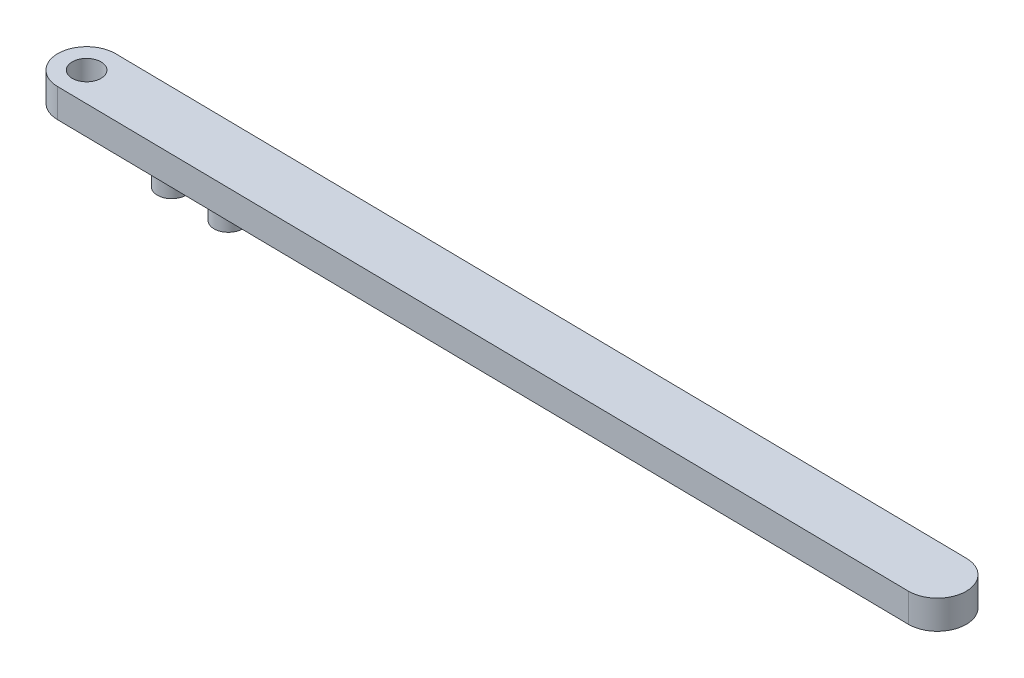
ISO-10303-21;
HEADER;
FILE_DESCRIPTION(('STEP AP214'),'2;1');
FILE_NAME('part.step','',(''),(''),'','','');
FILE_SCHEMA(('AUTOMOTIVE_DESIGN { 1 0 10303 214 1 1 1 1 }'));
ENDSEC;
DATA;
#1=APPLICATION_CONTEXT('core data for automotive mechanical design processes');
#2=APPLICATION_PROTOCOL_DEFINITION('international standard','automotive_design',2000,#1);
#3=PRODUCT_CONTEXT('',#1,'mechanical');
#4=PRODUCT('Part','Part','',(#3));
#5=PRODUCT_RELATED_PRODUCT_CATEGORY('part','',(#4));
#6=PRODUCT_DEFINITION_FORMATION('','',#4);
#7=PRODUCT_DEFINITION_CONTEXT('part definition',#1,'design');
#8=PRODUCT_DEFINITION('design','',#6,#7);
#9=PRODUCT_DEFINITION_SHAPE('','',#8);
#10=(LENGTH_UNIT() NAMED_UNIT(*) SI_UNIT(.MILLI.,.METRE.));
#11=(NAMED_UNIT(*) PLANE_ANGLE_UNIT() SI_UNIT($,.RADIAN.));
#12=(NAMED_UNIT(*) SI_UNIT($,.STERADIAN.) SOLID_ANGLE_UNIT());
#13=UNCERTAINTY_MEASURE_WITH_UNIT(LENGTH_MEASURE(1.E-05),#10,'distance_accuracy_value','');
#14=(GEOMETRIC_REPRESENTATION_CONTEXT(3) GLOBAL_UNCERTAINTY_ASSIGNED_CONTEXT((#13)) GLOBAL_UNIT_ASSIGNED_CONTEXT((#10,
#11,#12)) REPRESENTATION_CONTEXT('',''));
#15=CARTESIAN_POINT('',(0.,0.,0.));
#16=DIRECTION('',(0.,0.,1.));
#17=DIRECTION('',(1.,0.,0.));
#18=AXIS2_PLACEMENT_3D('',#15,#16,#17);
#19=CARTESIAN_POINT('',(-14.5716160355899,5.,-1.70714880270089));
#20=DIRECTION('',(0.,1.,0.));
#21=DIRECTION('',(0.,0.,1.));
#22=AXIS2_PLACEMENT_3D('',#19,#20,#21);
#23=PLANE('',#22);
#24=CARTESIAN_POINT('',(-14.5716160355899,5.,-1.70714880270089));
#25=DIRECTION('',(0.,1.,0.));
#26=DIRECTION('',(0.,0.,1.));
#27=AXIS2_PLACEMENT_3D('',#24,#25,#26);
#28=CIRCLE('',#27,5.);
#29=CARTESIAN_POINT('',(-14.5044435953561,5.,-6.70669756866698));
#30=VERTEX_POINT('',#29);
#31=CARTESIAN_POINT('',(-14.6387884758236,5.,3.2923999632652));
#32=VERTEX_POINT('',#31);
#33=EDGE_CURVE('E87',#30,#32,#28,.T.);
#34=ORIENTED_EDGE('',*,*,#33,.T.);
#35=DIRECTION('',(0.999909753193218,0.,0.013434488046742));
#36=VECTOR('',#35,1.);
#37=CARTESIAN_POINT('',(-14.6387884758236,5.,3.2923999632652));
#38=LINE('',#37,#36);
#39=CARTESIAN_POINT('',(135.361211524176,5.,5.30775504963758));
#40=VERTEX_POINT('',#39);
#41=EDGE_CURVE('E82',#32,#40,#38,.T.);
#42=ORIENTED_EDGE('',*,*,#41,.T.);
#43=CARTESIAN_POINT('',(135.42838396441,5.,0.308206283671487));
#44=DIRECTION('',(0.,1.,0.));
#45=DIRECTION('',(0.,0.,1.));
#46=AXIS2_PLACEMENT_3D('',#43,#44,#45);
#47=CIRCLE('',#46,5.);
#48=CARTESIAN_POINT('',(135.495556404644,5.,-4.6913424822946));
#49=VERTEX_POINT('',#48);
#50=EDGE_CURVE('E85',#40,#49,#47,.T.);
#51=ORIENTED_EDGE('',*,*,#50,.T.);
#52=DIRECTION('',(-0.999909753193218,0.,-0.013434488046742));
#53=VECTOR('',#52,1.);
#54=CARTESIAN_POINT('',(-14.5044435953561,5.,-6.70669756866698));
#55=LINE('',#54,#53);
#56=EDGE_CURVE('E52',#49,#30,#55,.T.);
#57=ORIENTED_EDGE('',*,*,#56,.T.);
#58=EDGE_LOOP('',(#34,#42,#51,#57));
#59=FACE_BOUND('',#58,.T.);
#60=CARTESIAN_POINT('',(-14.5716160355899,5.,-1.70714880270089));
#61=DIRECTION('',(0.,1.,0.));
#62=DIRECTION('',(0.,0.,1.));
#63=AXIS2_PLACEMENT_3D('',#60,#61,#62);
#64=CIRCLE('',#63,2.5);
#65=CARTESIAN_POINT('',(-14.5716160355899,5.,0.792851197299112));
#66=VERTEX_POINT('',#65);
#67=EDGE_CURVE('E103',#66,#66,#64,.T.);
#68=ORIENTED_EDGE('',*,*,#67,.F.);
#69=EDGE_LOOP('',(#68));
#70=FACE_BOUND('',#69,.T.);
#71=ADVANCED_FACE('F33',(#59,#70),#23,.T.);
#72=CARTESIAN_POINT('',(-14.5716160355899,0.,-1.70714880270089));
#73=DIRECTION('',(0.,1.,0.));
#74=DIRECTION('',(0.,0.,1.));
#75=AXIS2_PLACEMENT_3D('',#72,#73,#74);
#76=PLANE('',#75);
#77=CARTESIAN_POINT('',(10.4283839644101,0.,-1.37125628830549));
#78=DIRECTION('',(0.,1.,0.));
#79=DIRECTION('',(0.,0.,1.));
#80=AXIS2_PLACEMENT_3D('',#77,#78,#79);
#81=CIRCLE('',#80,2.5);
#82=CARTESIAN_POINT('',(10.4283839644101,0.,1.12874371169451));
#83=VERTEX_POINT('',#82);
#84=EDGE_CURVE('E37',#83,#83,#81,.T.);
#85=ORIENTED_EDGE('',*,*,#84,.T.);
#86=EDGE_LOOP('',(#85));
#87=FACE_BOUND('',#86,.T.);
#88=CARTESIAN_POINT('',(0.428383964410139,0.,-1.50561329406365));
#89=DIRECTION('',(0.,1.,0.));
#90=DIRECTION('',(0.,0.,1.));
#91=AXIS2_PLACEMENT_3D('',#88,#89,#90);
#92=CIRCLE('',#91,2.5);
#93=CARTESIAN_POINT('',(0.428383964410139,0.,0.994386705936352));
#94=VERTEX_POINT('',#93);
#95=EDGE_CURVE('E108',#94,#94,#92,.T.);
#96=ORIENTED_EDGE('',*,*,#95,.T.);
#97=EDGE_LOOP('',(#96));
#98=FACE_BOUND('',#97,.T.);
#99=CARTESIAN_POINT('',(-14.5716160355899,0.,-1.70714880270089));
#100=DIRECTION('',(0.,1.,0.));
#101=DIRECTION('',(0.,0.,1.));
#102=AXIS2_PLACEMENT_3D('',#99,#100,#101);
#103=CIRCLE('',#102,5.);
#104=CARTESIAN_POINT('',(-14.5044435953561,0.,-6.70669756866698));
#105=VERTEX_POINT('',#104);
#106=CARTESIAN_POINT('',(-14.6387884758236,0.,3.2923999632652));
#107=VERTEX_POINT('',#106);
#108=EDGE_CURVE('E100',#105,#107,#103,.T.);
#109=ORIENTED_EDGE('',*,*,#108,.F.);
#110=DIRECTION('',(-0.999909753193218,0.,-0.013434488046742));
#111=VECTOR('',#110,1.);
#112=CARTESIAN_POINT('',(-14.5044435953561,0.,-6.70669756866698));
#113=LINE('',#112,#111);
#114=CARTESIAN_POINT('',(135.495556404644,0.,-4.6913424822946));
#115=VERTEX_POINT('',#114);
#116=EDGE_CURVE('E75',#115,#105,#113,.T.);
#117=ORIENTED_EDGE('',*,*,#116,.F.);
#118=CARTESIAN_POINT('',(135.42838396441,0.,0.308206283671487));
#119=DIRECTION('',(0.,1.,0.));
#120=DIRECTION('',(0.,0.,1.));
#121=AXIS2_PLACEMENT_3D('',#118,#119,#120);
#122=CIRCLE('',#121,5.);
#123=CARTESIAN_POINT('',(135.361211524176,0.,5.30775504963758));
#124=VERTEX_POINT('',#123);
#125=EDGE_CURVE('E69',#124,#115,#122,.T.);
#126=ORIENTED_EDGE('',*,*,#125,.F.);
#127=DIRECTION('',(0.999909753193218,0.,0.013434488046742));
#128=VECTOR('',#127,1.);
#129=CARTESIAN_POINT('',(-14.6387884758236,0.,3.2923999632652));
#130=LINE('',#129,#128);
#131=EDGE_CURVE('E91',#107,#124,#130,.T.);
#132=ORIENTED_EDGE('',*,*,#131,.F.);
#133=EDGE_LOOP('',(#109,#117,#126,#132));
#134=FACE_BOUND('',#133,.T.);
#135=CARTESIAN_POINT('',(-14.5716160355899,0.,-1.70714880270089));
#136=DIRECTION('',(0.,1.,0.));
#137=DIRECTION('',(0.,0.,1.));
#138=AXIS2_PLACEMENT_3D('',#135,#136,#137);
#139=CIRCLE('',#138,2.5);
#140=CARTESIAN_POINT('',(-14.5716160355899,0.,0.792851197299112));
#141=VERTEX_POINT('',#140);
#142=EDGE_CURVE('E110',#141,#141,#139,.T.);
#143=ORIENTED_EDGE('',*,*,#142,.T.);
#144=EDGE_LOOP('',(#143));
#145=FACE_BOUND('',#144,.T.);
#146=ADVANCED_FACE('F130',(#87,#98,#134,#145),#76,.F.);
#147=CARTESIAN_POINT('',(-14.5716160355899,5.,-1.70714880270089));
#148=DIRECTION('',(0.,-1.,0.));
#149=DIRECTION('',(0.,0.,-1.));
#150=AXIS2_PLACEMENT_3D('',#147,#148,#149);
#151=CYLINDRICAL_SURFACE('',#150,5.);
#152=ORIENTED_EDGE('',*,*,#108,.T.);
#153=DIRECTION('',(0.,-1.,0.));
#154=VECTOR('',#153,1.);
#155=CARTESIAN_POINT('',(-14.6387884758236,5.,3.2923999632652));
#156=LINE('',#155,#154);
#157=EDGE_CURVE('E11',#32,#107,#156,.T.);
#158=ORIENTED_EDGE('',*,*,#157,.F.);
#159=ORIENTED_EDGE('',*,*,#33,.F.);
#160=DIRECTION('',(0.,-1.,0.));
#161=VECTOR('',#160,1.);
#162=CARTESIAN_POINT('',(-14.5044435953561,5.,-6.70669756866698));
#163=LINE('',#162,#161);
#164=EDGE_CURVE('E96',#30,#105,#163,.T.);
#165=ORIENTED_EDGE('',*,*,#164,.T.);
#166=EDGE_LOOP('',(#152,#158,#159,#165));
#167=FACE_BOUND('',#166,.T.);
#168=ADVANCED_FACE('F35',(#167),#151,.T.);
#169=CARTESIAN_POINT('',(-14.6387884758236,5.,3.2923999632652));
#170=DIRECTION('',(0.013434488046742,0.,-0.999909753193218));
#171=DIRECTION('',(-0.999909753193218,0.,-0.013434488046742));
#172=AXIS2_PLACEMENT_3D('',#169,#170,#171);
#173=PLANE('',#172);
#174=ORIENTED_EDGE('',*,*,#131,.T.);
#175=DIRECTION('',(0.,-1.,0.));
#176=VECTOR('',#175,1.);
#177=CARTESIAN_POINT('',(135.361211524176,5.,5.30775504963758));
#178=LINE('',#177,#176);
#179=EDGE_CURVE('E43',#40,#124,#178,.T.);
#180=ORIENTED_EDGE('',*,*,#179,.F.);
#181=ORIENTED_EDGE('',*,*,#41,.F.);
#182=ORIENTED_EDGE('',*,*,#157,.T.);
#183=EDGE_LOOP('',(#174,#180,#181,#182));
#184=FACE_BOUND('',#183,.T.);
#185=ADVANCED_FACE('F90',(#184),#173,.F.);
#186=CARTESIAN_POINT('',(135.42838396441,5.,0.308206283671487));
#187=DIRECTION('',(0.,-1.,0.));
#188=DIRECTION('',(0.,0.,-1.));
#189=AXIS2_PLACEMENT_3D('',#186,#187,#188);
#190=CYLINDRICAL_SURFACE('',#189,5.);
#191=ORIENTED_EDGE('',*,*,#125,.T.);
#192=DIRECTION('',(0.,-1.,0.));
#193=VECTOR('',#192,1.);
#194=CARTESIAN_POINT('',(135.495556404644,5.,-4.6913424822946));
#195=LINE('',#194,#193);
#196=EDGE_CURVE('E92',#49,#115,#195,.T.);
#197=ORIENTED_EDGE('',*,*,#196,.F.);
#198=ORIENTED_EDGE('',*,*,#50,.F.);
#199=ORIENTED_EDGE('',*,*,#179,.T.);
#200=EDGE_LOOP('',(#191,#197,#198,#199));
#201=FACE_BOUND('',#200,.T.);
#202=ADVANCED_FACE('F94',(#201),#190,.T.);
#203=CARTESIAN_POINT('',(-14.5044435953561,5.,-6.70669756866698));
#204=DIRECTION('',(-0.013434488046742,0.,0.999909753193218));
#205=DIRECTION('',(0.999909753193218,0.,0.013434488046742));
#206=AXIS2_PLACEMENT_3D('',#203,#204,#205);
#207=PLANE('',#206);
#208=ORIENTED_EDGE('',*,*,#116,.T.);
#209=ORIENTED_EDGE('',*,*,#164,.F.);
#210=ORIENTED_EDGE('',*,*,#56,.F.);
#211=ORIENTED_EDGE('',*,*,#196,.T.);
#212=EDGE_LOOP('',(#208,#209,#210,#211));
#213=FACE_BOUND('',#212,.T.);
#214=ADVANCED_FACE('F140',(#213),#207,.F.);
#215=CARTESIAN_POINT('',(-14.5716160355899,5.,-1.70714880270089));
#216=DIRECTION('',(0.,-1.,0.));
#217=DIRECTION('',(0.,0.,-1.));
#218=AXIS2_PLACEMENT_3D('',#215,#216,#217);
#219=CYLINDRICAL_SURFACE('',#218,2.5);
#220=ORIENTED_EDGE('',*,*,#67,.T.);
#221=EDGE_LOOP('',(#220));
#222=FACE_BOUND('',#221,.T.);
#223=ORIENTED_EDGE('',*,*,#142,.F.);
#224=EDGE_LOOP('',(#223));
#225=FACE_BOUND('',#224,.T.);
#226=ADVANCED_FACE('F127',(#222,#225),#219,.F.);
#227=CARTESIAN_POINT('',(0.428383964410139,-5.,-1.50561329406365));
#228=DIRECTION('',(0.,1.,0.));
#229=DIRECTION('',(0.,0.,1.));
#230=AXIS2_PLACEMENT_3D('',#227,#228,#229);
#231=CYLINDRICAL_SURFACE('',#230,2.5);
#232=CARTESIAN_POINT('',(0.428383964410139,-5.,-1.50561329406365));
#233=DIRECTION('',(0.,1.,0.));
#234=DIRECTION('',(0.,0.,1.));
#235=AXIS2_PLACEMENT_3D('',#232,#233,#234);
#236=CIRCLE('',#235,2.5);
#237=CARTESIAN_POINT('',(0.428383964410139,-5.,0.994386705936352));
#238=VERTEX_POINT('',#237);
#239=EDGE_CURVE('E111',#238,#238,#236,.T.);
#240=ORIENTED_EDGE('',*,*,#239,.T.);
#241=EDGE_LOOP('',(#240));
#242=FACE_BOUND('',#241,.T.);
#243=ORIENTED_EDGE('',*,*,#95,.F.);
#244=EDGE_LOOP('',(#243));
#245=FACE_BOUND('',#244,.T.);
#246=ADVANCED_FACE('F156',(#242,#245),#231,.T.);
#247=CARTESIAN_POINT('',(0.428383964410139,-5.,-1.50561329406365));
#248=DIRECTION('',(0.,1.,0.));
#249=DIRECTION('',(0.,0.,1.));
#250=AXIS2_PLACEMENT_3D('',#247,#248,#249);
#251=PLANE('',#250);
#252=ORIENTED_EDGE('',*,*,#239,.F.);
#253=EDGE_LOOP('',(#252));
#254=FACE_BOUND('',#253,.T.);
#255=ADVANCED_FACE('F160',(#254),#251,.F.);
#256=CARTESIAN_POINT('',(10.4283839644101,-5.,-1.37125628830549));
#257=DIRECTION('',(0.,1.,0.));
#258=DIRECTION('',(0.,0.,1.));
#259=AXIS2_PLACEMENT_3D('',#256,#257,#258);
#260=CYLINDRICAL_SURFACE('',#259,2.5);
#261=CARTESIAN_POINT('',(10.4283839644101,-5.,-1.37125628830549));
#262=DIRECTION('',(0.,1.,0.));
#263=DIRECTION('',(0.,0.,1.));
#264=AXIS2_PLACEMENT_3D('',#261,#262,#263);
#265=CIRCLE('',#264,2.5);
#266=CARTESIAN_POINT('',(10.4283839644101,-5.,1.12874371169451));
#267=VERTEX_POINT('',#266);
#268=EDGE_CURVE('E121',#267,#267,#265,.T.);
#269=ORIENTED_EDGE('',*,*,#268,.T.);
#270=EDGE_LOOP('',(#269));
#271=FACE_BOUND('',#270,.T.);
#272=ORIENTED_EDGE('',*,*,#84,.F.);
#273=EDGE_LOOP('',(#272));
#274=FACE_BOUND('',#273,.T.);
#275=ADVANCED_FACE('F164',(#271,#274),#260,.T.);
#276=CARTESIAN_POINT('',(10.4283839644101,-5.,-1.37125628830549));
#277=DIRECTION('',(0.,1.,0.));
#278=DIRECTION('',(0.,0.,1.));
#279=AXIS2_PLACEMENT_3D('',#276,#277,#278);
#280=PLANE('',#279);
#281=ORIENTED_EDGE('',*,*,#268,.F.);
#282=EDGE_LOOP('',(#281));
#283=FACE_BOUND('',#282,.T.);
#284=ADVANCED_FACE('F171',(#283),#280,.F.);
#285=CLOSED_SHELL('',(#71,#146,#168,#185,#202,#214,#226,#246,#255,#275,#284));
#286=MANIFOLD_SOLID_BREP('B2',#285);
#287=ADVANCED_BREP_SHAPE_REPRESENTATION('',(#18,#286),#14);
#288=SHAPE_DEFINITION_REPRESENTATION(#9,#287);
ENDSEC;
END-ISO-10303-21;
